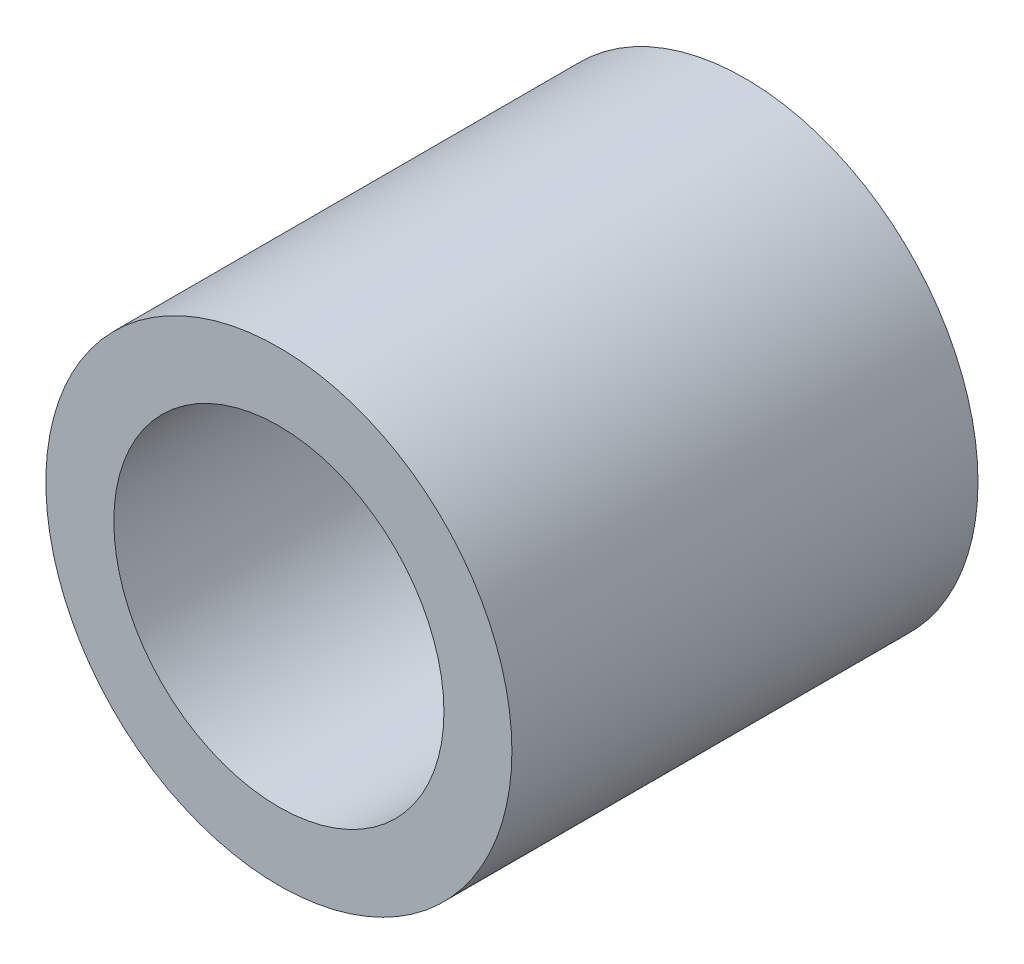
ISO-10303-21;
HEADER;
FILE_DESCRIPTION(('STEP AP214'),'2;1');
FILE_NAME('part.step','',(''),(''),'','','');
FILE_SCHEMA(('AUTOMOTIVE_DESIGN { 1 0 10303 214 1 1 1 1 }'));
ENDSEC;
DATA;
#1=APPLICATION_CONTEXT('core data for automotive mechanical design processes');
#2=APPLICATION_PROTOCOL_DEFINITION('international standard','automotive_design',2000,#1);
#3=PRODUCT_CONTEXT('',#1,'mechanical');
#4=PRODUCT('Part','Part','',(#3));
#5=PRODUCT_RELATED_PRODUCT_CATEGORY('part','',(#4));
#6=PRODUCT_DEFINITION_FORMATION('','',#4);
#7=PRODUCT_DEFINITION_CONTEXT('part definition',#1,'design');
#8=PRODUCT_DEFINITION('design','',#6,#7);
#9=PRODUCT_DEFINITION_SHAPE('','',#8);
#10=(LENGTH_UNIT() NAMED_UNIT(*) SI_UNIT(.MILLI.,.METRE.));
#11=(NAMED_UNIT(*) PLANE_ANGLE_UNIT() SI_UNIT($,.RADIAN.));
#12=(NAMED_UNIT(*) SI_UNIT($,.STERADIAN.) SOLID_ANGLE_UNIT());
#13=UNCERTAINTY_MEASURE_WITH_UNIT(LENGTH_MEASURE(1.E-05),#10,'distance_accuracy_value','');
#14=(GEOMETRIC_REPRESENTATION_CONTEXT(3) GLOBAL_UNCERTAINTY_ASSIGNED_CONTEXT((#13)) GLOBAL_UNIT_ASSIGNED_CONTEXT((#10,
#11,#12)) REPRESENTATION_CONTEXT('',''));
#15=CARTESIAN_POINT('',(0.,0.,0.));
#16=DIRECTION('',(0.,0.,1.));
#17=DIRECTION('',(1.,0.,0.));
#18=AXIS2_PLACEMENT_3D('',#15,#16,#17);
#19=CARTESIAN_POINT('',(-33.,0.,12.));
#20=DIRECTION('',(0.,0.,1.));
#21=DIRECTION('',(1.,0.,0.));
#22=AXIS2_PLACEMENT_3D('',#19,#20,#21);
#23=PLANE('',#22);
#24=CARTESIAN_POINT('',(-33.,0.,12.));
#25=DIRECTION('',(0.,0.,1.));
#26=DIRECTION('',(1.,0.,0.));
#27=AXIS2_PLACEMENT_3D('',#24,#25,#26);
#28=CIRCLE('',#27,6.);
#29=CARTESIAN_POINT('',(-27.,0.,12.));
#30=VERTEX_POINT('',#29);
#31=EDGE_CURVE('E10',#30,#30,#28,.T.);
#32=ORIENTED_EDGE('',*,*,#31,.T.);
#33=EDGE_LOOP('',(#32));
#34=FACE_BOUND('',#33,.T.);
#35=CARTESIAN_POINT('',(-33.,0.,12.));
#36=DIRECTION('',(0.,0.,1.));
#37=DIRECTION('',(1.,0.,0.));
#38=AXIS2_PLACEMENT_3D('',#35,#36,#37);
#39=CIRCLE('',#38,4.25);
#40=CARTESIAN_POINT('',(-28.75,0.,12.));
#41=VERTEX_POINT('',#40);
#42=EDGE_CURVE('E41',#41,#41,#39,.T.);
#43=ORIENTED_EDGE('',*,*,#42,.F.);
#44=EDGE_LOOP('',(#43));
#45=FACE_BOUND('',#44,.T.);
#46=ADVANCED_FACE('F30',(#34,#45),#23,.T.);
#47=CARTESIAN_POINT('',(-33.,0.,0.));
#48=DIRECTION('',(0.,0.,1.));
#49=DIRECTION('',(1.,0.,0.));
#50=AXIS2_PLACEMENT_3D('',#47,#48,#49);
#51=PLANE('',#50);
#52=CARTESIAN_POINT('',(-33.,0.,0.));
#53=DIRECTION('',(0.,0.,1.));
#54=DIRECTION('',(1.,0.,0.));
#55=AXIS2_PLACEMENT_3D('',#52,#53,#54);
#56=CIRCLE('',#55,6.);
#57=CARTESIAN_POINT('',(-27.,0.,0.));
#58=VERTEX_POINT('',#57);
#59=EDGE_CURVE('E34',#58,#58,#56,.T.);
#60=ORIENTED_EDGE('',*,*,#59,.F.);
#61=EDGE_LOOP('',(#60));
#62=FACE_BOUND('',#61,.T.);
#63=CARTESIAN_POINT('',(-33.,0.,0.));
#64=DIRECTION('',(0.,0.,1.));
#65=DIRECTION('',(1.,0.,0.));
#66=AXIS2_PLACEMENT_3D('',#63,#64,#65);
#67=CIRCLE('',#66,4.25);
#68=CARTESIAN_POINT('',(-28.75,0.,0.));
#69=VERTEX_POINT('',#68);
#70=EDGE_CURVE('E43',#69,#69,#67,.T.);
#71=ORIENTED_EDGE('',*,*,#70,.T.);
#72=EDGE_LOOP('',(#71));
#73=FACE_BOUND('',#72,.T.);
#74=ADVANCED_FACE('F53',(#62,#73),#51,.F.);
#75=CARTESIAN_POINT('',(-33.,0.,12.));
#76=DIRECTION('',(0.,0.,-1.));
#77=DIRECTION('',(-1.,0.,0.));
#78=AXIS2_PLACEMENT_3D('',#75,#76,#77);
#79=CYLINDRICAL_SURFACE('',#78,6.);
#80=ORIENTED_EDGE('',*,*,#31,.F.);
#81=EDGE_LOOP('',(#80));
#82=FACE_BOUND('',#81,.T.);
#83=ORIENTED_EDGE('',*,*,#59,.T.);
#84=EDGE_LOOP('',(#83));
#85=FACE_BOUND('',#84,.T.);
#86=ADVANCED_FACE('F32',(#82,#85),#79,.T.);
#87=CARTESIAN_POINT('',(-33.,0.,12.));
#88=DIRECTION('',(0.,0.,-1.));
#89=DIRECTION('',(-1.,0.,0.));
#90=AXIS2_PLACEMENT_3D('',#87,#88,#89);
#91=CYLINDRICAL_SURFACE('',#90,4.25);
#92=ORIENTED_EDGE('',*,*,#42,.T.);
#93=EDGE_LOOP('',(#92));
#94=FACE_BOUND('',#93,.T.);
#95=ORIENTED_EDGE('',*,*,#70,.F.);
#96=EDGE_LOOP('',(#95));
#97=FACE_BOUND('',#96,.T.);
#98=ADVANCED_FACE('F49',(#94,#97),#91,.F.);
#99=CLOSED_SHELL('',(#46,#74,#86,#98));
#100=MANIFOLD_SOLID_BREP('B2',#99);
#101=ADVANCED_BREP_SHAPE_REPRESENTATION('',(#18,#100),#14);
#102=SHAPE_DEFINITION_REPRESENTATION(#9,#101);
ENDSEC;
END-ISO-10303-21;
